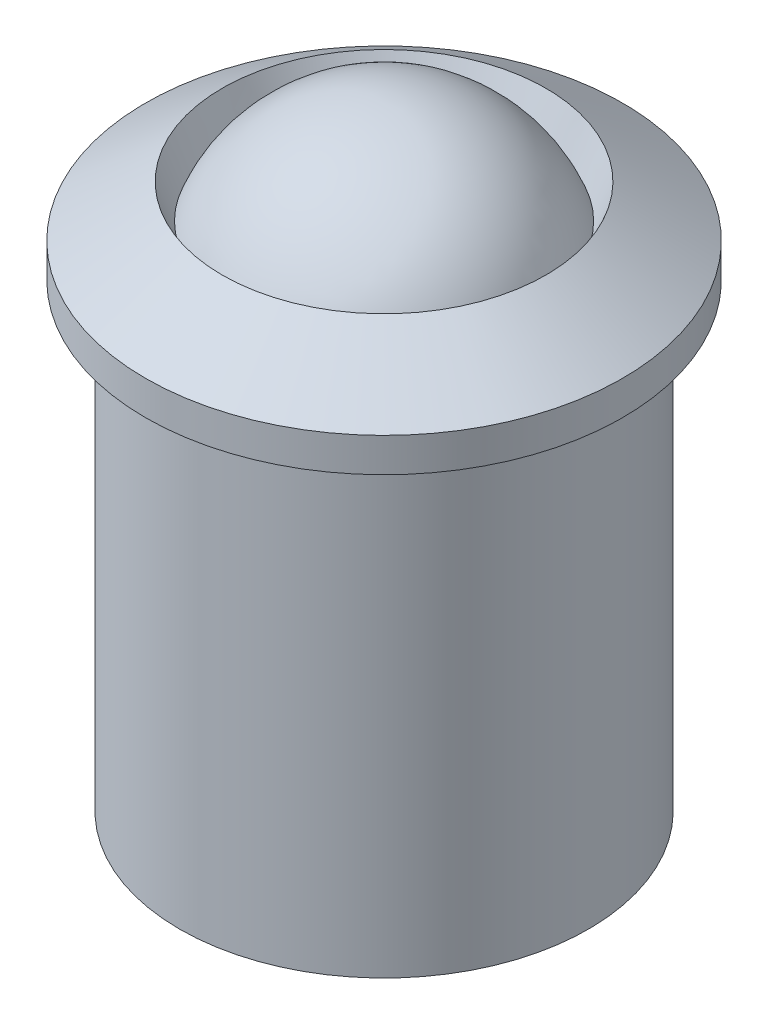
ISO-10303-21;
HEADER;
FILE_DESCRIPTION(('STEP AP214'),'2;1');
FILE_NAME('part.step','',(''),(''),'','','');
FILE_SCHEMA(('AUTOMOTIVE_DESIGN { 1 0 10303 214 1 1 1 1 }'));
ENDSEC;
DATA;
#1=APPLICATION_CONTEXT('core data for automotive mechanical design processes');
#2=APPLICATION_PROTOCOL_DEFINITION('international standard','automotive_design',2000,#1);
#3=PRODUCT_CONTEXT('',#1,'mechanical');
#4=PRODUCT('Part','Part','',(#3));
#5=PRODUCT_RELATED_PRODUCT_CATEGORY('part','',(#4));
#6=PRODUCT_DEFINITION_FORMATION('','',#4);
#7=PRODUCT_DEFINITION_CONTEXT('part definition',#1,'design');
#8=PRODUCT_DEFINITION('design','',#6,#7);
#9=PRODUCT_DEFINITION_SHAPE('','',#8);
#10=(LENGTH_UNIT() NAMED_UNIT(*) SI_UNIT(.MILLI.,.METRE.));
#11=(NAMED_UNIT(*) PLANE_ANGLE_UNIT() SI_UNIT($,.RADIAN.));
#12=(NAMED_UNIT(*) SI_UNIT($,.STERADIAN.) SOLID_ANGLE_UNIT());
#13=UNCERTAINTY_MEASURE_WITH_UNIT(LENGTH_MEASURE(1.E-05),#10,'distance_accuracy_value','');
#14=(GEOMETRIC_REPRESENTATION_CONTEXT(3) GLOBAL_UNCERTAINTY_ASSIGNED_CONTEXT((#13)) GLOBAL_UNIT_ASSIGNED_CONTEXT((#10,
#11,#12)) REPRESENTATION_CONTEXT('',''));
#15=CARTESIAN_POINT('',(0.,0.,0.));
#16=DIRECTION('',(0.,0.,1.));
#17=DIRECTION('',(1.,0.,0.));
#18=AXIS2_PLACEMENT_3D('',#15,#16,#17);
#19=CARTESIAN_POINT('',(0.,0.,0.));
#20=DIRECTION('',(0.,-1.,0.));
#21=DIRECTION('',(0.,0.,-1.));
#22=AXIS2_PLACEMENT_3D('',#19,#20,#21);
#23=PLANE('',#22);
#24=CARTESIAN_POINT('',(0.,0.,0.));
#25=DIRECTION('',(0.,-1.,0.));
#26=DIRECTION('',(0.,0.,-1.));
#27=AXIS2_PLACEMENT_3D('',#24,#25,#26);
#28=CIRCLE('',#27,5.);
#29=CARTESIAN_POINT('',(0.,0.,-5.));
#30=VERTEX_POINT('',#29);
#31=EDGE_CURVE('E54',#30,#30,#28,.T.);
#32=ORIENTED_EDGE('',*,*,#31,.F.);
#33=EDGE_LOOP('',(#32));
#34=FACE_BOUND('',#33,.T.);
#35=CARTESIAN_POINT('',(0.,0.,0.));
#36=DIRECTION('',(0.,1.,0.));
#37=DIRECTION('',(0.,0.,1.));
#38=AXIS2_PLACEMENT_3D('',#35,#36,#37);
#39=CIRCLE('',#38,6.);
#40=CARTESIAN_POINT('',(0.,0.,6.));
#41=VERTEX_POINT('',#40);
#42=EDGE_CURVE('E10',#41,#41,#39,.T.);
#43=ORIENTED_EDGE('',*,*,#42,.F.);
#44=EDGE_LOOP('',(#43));
#45=FACE_BOUND('',#44,.T.);
#46=ADVANCED_FACE('F31',(#34,#45),#23,.T.);
#47=CARTESIAN_POINT('',(0.,15.,0.));
#48=DIRECTION('',(0.,1.,0.));
#49=DIRECTION('',(0.,0.,1.));
#50=AXIS2_PLACEMENT_3D('',#47,#48,#49);
#51=CYLINDRICAL_SURFACE('',#50,6.);
#52=ORIENTED_EDGE('',*,*,#42,.T.);
#53=EDGE_LOOP('',(#52));
#54=FACE_BOUND('',#53,.T.);
#55=CARTESIAN_POINT('',(0.,13.5,0.));
#56=DIRECTION('',(0.,1.,0.));
#57=DIRECTION('',(0.,0.,1.));
#58=AXIS2_PLACEMENT_3D('',#55,#56,#57);
#59=CIRCLE('',#58,6.);
#60=CARTESIAN_POINT('',(0.,13.5,6.));
#61=VERTEX_POINT('',#60);
#62=EDGE_CURVE('E39',#61,#61,#59,.T.);
#63=ORIENTED_EDGE('',*,*,#62,.F.);
#64=EDGE_LOOP('',(#63));
#65=FACE_BOUND('',#64,.T.);
#66=ADVANCED_FACE('F80',(#54,#65),#51,.T.);
#67=CARTESIAN_POINT('',(0.,13.5,6.));
#68=DIRECTION('',(0.,-1.,0.));
#69=DIRECTION('',(0.,0.,-1.));
#70=AXIS2_PLACEMENT_3D('',#67,#68,#69);
#71=PLANE('',#70);
#72=ORIENTED_EDGE('',*,*,#62,.T.);
#73=EDGE_LOOP('',(#72));
#74=FACE_BOUND('',#73,.T.);
#75=CARTESIAN_POINT('',(0.,13.5,0.));
#76=DIRECTION('',(0.,1.,0.));
#77=DIRECTION('',(0.,0.,1.));
#78=AXIS2_PLACEMENT_3D('',#75,#76,#77);
#79=CIRCLE('',#78,7.);
#80=CARTESIAN_POINT('',(0.,13.5,7.));
#81=VERTEX_POINT('',#80);
#82=EDGE_CURVE('E43',#81,#81,#79,.T.);
#83=ORIENTED_EDGE('',*,*,#82,.F.);
#84=EDGE_LOOP('',(#83));
#85=FACE_BOUND('',#84,.T.);
#86=ADVANCED_FACE('F85',(#74,#85),#71,.T.);
#87=CARTESIAN_POINT('',(0.,15.,0.));
#88=DIRECTION('',(0.,1.,0.));
#89=DIRECTION('',(0.,0.,1.));
#90=AXIS2_PLACEMENT_3D('',#87,#88,#89);
#91=CYLINDRICAL_SURFACE('',#90,7.);
#92=ORIENTED_EDGE('',*,*,#82,.T.);
#93=EDGE_LOOP('',(#92));
#94=FACE_BOUND('',#93,.T.);
#95=CARTESIAN_POINT('',(0.,14.5,0.));
#96=DIRECTION('',(0.,1.,0.));
#97=DIRECTION('',(0.,0.,1.));
#98=AXIS2_PLACEMENT_3D('',#95,#96,#97);
#99=CIRCLE('',#98,7.);
#100=CARTESIAN_POINT('',(0.,14.5,7.));
#101=VERTEX_POINT('',#100);
#102=EDGE_CURVE('E48',#101,#101,#99,.T.);
#103=ORIENTED_EDGE('',*,*,#102,.F.);
#104=EDGE_LOOP('',(#103));
#105=FACE_BOUND('',#104,.T.);
#106=ADVANCED_FACE('F75',(#94,#105),#91,.T.);
#107=CARTESIAN_POINT('',(0.,16.,0.));
#108=DIRECTION('',(0.,-1.,0.));
#109=DIRECTION('',(0.,0.,-1.));
#110=AXIS2_PLACEMENT_3D('',#107,#108,#109);
#111=CONICAL_SURFACE('',#110,4.75,0.982793723247329);
#112=ORIENTED_EDGE('',*,*,#102,.T.);
#113=EDGE_LOOP('',(#112));
#114=FACE_BOUND('',#113,.T.);
#115=CARTESIAN_POINT('',(0.,16.,0.));
#116=DIRECTION('',(0.,1.,0.));
#117=DIRECTION('',(0.,0.,1.));
#118=AXIS2_PLACEMENT_3D('',#115,#116,#117);
#119=CIRCLE('',#118,4.75);
#120=CARTESIAN_POINT('',(0.,16.,4.75));
#121=VERTEX_POINT('',#120);
#122=EDGE_CURVE('E51',#121,#121,#119,.T.);
#123=ORIENTED_EDGE('',*,*,#122,.F.);
#124=EDGE_LOOP('',(#123));
#125=FACE_BOUND('',#124,.T.);
#126=ADVANCED_FACE('F67',(#114,#125),#111,.T.);
#127=CARTESIAN_POINT('',(0.,15.,0.));
#128=DIRECTION('',(0.,1.,0.));
#129=DIRECTION('',(0.,0.,1.));
#130=AXIS2_PLACEMENT_3D('',#127,#128,#129);
#131=CONICAL_SURFACE('',#130,4.35,0.380506377112365);
#132=ORIENTED_EDGE('',*,*,#122,.T.);
#133=EDGE_LOOP('',(#132));
#134=FACE_BOUND('',#133,.T.);
#135=CARTESIAN_POINT('',(0.,15.,0.));
#136=DIRECTION('',(0.,1.,0.));
#137=DIRECTION('',(0.,0.,1.));
#138=AXIS2_PLACEMENT_3D('',#135,#136,#137);
#139=CIRCLE('',#138,4.35);
#140=CARTESIAN_POINT('',(0.,15.,4.35));
#141=VERTEX_POINT('',#140);
#142=EDGE_CURVE('E35',#141,#141,#139,.T.);
#143=ORIENTED_EDGE('',*,*,#142,.F.);
#144=EDGE_LOOP('',(#143));
#145=FACE_BOUND('',#144,.T.);
#146=ADVANCED_FACE('F65',(#134,#145),#131,.F.);
#147=CARTESIAN_POINT('',(0.,13.34625,0.));
#148=DIRECTION('',(0.,0.,1.));
#149=DIRECTION('',(1.,0.,0.));
#150=AXIS2_PLACEMENT_3D('',#147,#148,#149);
#151=SPHERICAL_SURFACE('',#150,4.65375);
#152=CARTESIAN_POINT('',(0.,13.34625,0.));
#153=DIRECTION('',(0.,1.,0.));
#154=DIRECTION('',(0.,0.,1.));
#155=AXIS2_PLACEMENT_3D('',#152,#153,#154);
#156=SPHERICAL_SURFACE('',#155,4.65375);
#157=ORIENTED_EDGE('',*,*,#142,.T.);
#158=EDGE_LOOP('',(#157));
#159=FACE_BOUND('',#158,.T.);
#160=ADVANCED_FACE('F33',(#159),#156,.T.);
#161=CARTESIAN_POINT('',(0.,7.5,0.));
#162=DIRECTION('',(0.,-1.,0.));
#163=DIRECTION('',(0.,0.,-1.));
#164=AXIS2_PLACEMENT_3D('',#161,#162,#163);
#165=CYLINDRICAL_SURFACE('',#164,5.);
#166=CARTESIAN_POINT('',(0.,7.5,0.));
#167=DIRECTION('',(0.,-1.,0.));
#168=DIRECTION('',(0.,0.,-1.));
#169=AXIS2_PLACEMENT_3D('',#166,#167,#168);
#170=CIRCLE('',#169,5.);
#171=CARTESIAN_POINT('',(0.,7.5,-5.));
#172=VERTEX_POINT('',#171);
#173=EDGE_CURVE('E57',#172,#172,#170,.T.);
#174=ORIENTED_EDGE('',*,*,#173,.F.);
#175=EDGE_LOOP('',(#174));
#176=FACE_BOUND('',#175,.T.);
#177=ORIENTED_EDGE('',*,*,#31,.T.);
#178=EDGE_LOOP('',(#177));
#179=FACE_BOUND('',#178,.T.);
#180=ADVANCED_FACE('F74',(#176,#179),#165,.F.);
#181=CARTESIAN_POINT('',(0.,7.5,0.));
#182=DIRECTION('',(0.,-1.,0.));
#183=DIRECTION('',(0.,0.,-1.));
#184=AXIS2_PLACEMENT_3D('',#181,#182,#183);
#185=PLANE('',#184);
#186=ORIENTED_EDGE('',*,*,#173,.T.);
#187=EDGE_LOOP('',(#186));
#188=FACE_BOUND('',#187,.T.);
#189=ADVANCED_FACE('F133',(#188),#185,.T.);
#190=CLOSED_SHELL('',(#46,#66,#86,#106,#126,#146,#160,#180,#189));
#191=MANIFOLD_SOLID_BREP('B2',#190);
#192=ADVANCED_BREP_SHAPE_REPRESENTATION('',(#18,#191),#14);
#193=SHAPE_DEFINITION_REPRESENTATION(#9,#192);
ENDSEC;
END-ISO-10303-21;
